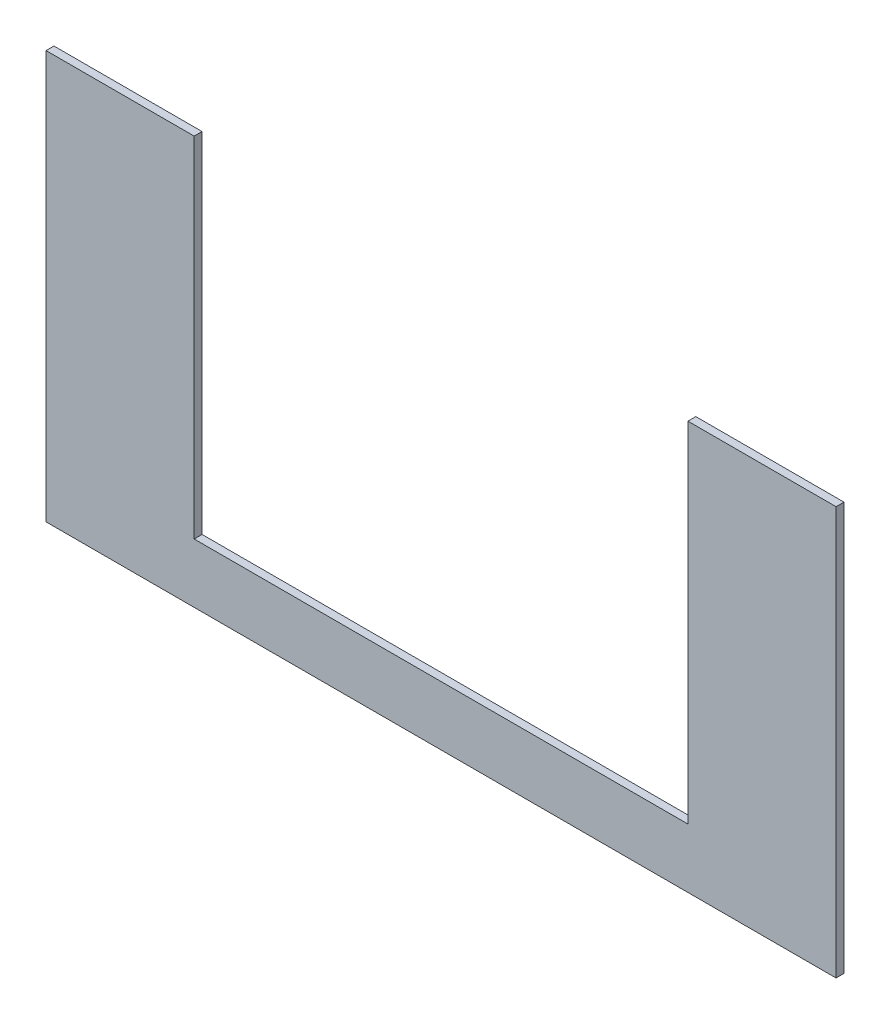
ISO-10303-21;
HEADER;
FILE_DESCRIPTION(('STEP AP214'),'2;1');
FILE_NAME('part.step','',(''),(''),'','','');
FILE_SCHEMA(('AUTOMOTIVE_DESIGN { 1 0 10303 214 1 1 1 1 }'));
ENDSEC;
DATA;
#1=APPLICATION_CONTEXT('core data for automotive mechanical design processes');
#2=APPLICATION_PROTOCOL_DEFINITION('international standard','automotive_design',2000,#1);
#3=PRODUCT_CONTEXT('',#1,'mechanical');
#4=PRODUCT('Part','Part','',(#3));
#5=PRODUCT_RELATED_PRODUCT_CATEGORY('part','',(#4));
#6=PRODUCT_DEFINITION_FORMATION('','',#4);
#7=PRODUCT_DEFINITION_CONTEXT('part definition',#1,'design');
#8=PRODUCT_DEFINITION('design','',#6,#7);
#9=PRODUCT_DEFINITION_SHAPE('','',#8);
#10=(LENGTH_UNIT() NAMED_UNIT(*) SI_UNIT(.MILLI.,.METRE.));
#11=(NAMED_UNIT(*) PLANE_ANGLE_UNIT() SI_UNIT($,.RADIAN.));
#12=(NAMED_UNIT(*) SI_UNIT($,.STERADIAN.) SOLID_ANGLE_UNIT());
#13=UNCERTAINTY_MEASURE_WITH_UNIT(LENGTH_MEASURE(1.E-05),#10,'distance_accuracy_value','');
#14=(GEOMETRIC_REPRESENTATION_CONTEXT(3) GLOBAL_UNCERTAINTY_ASSIGNED_CONTEXT((#13)) GLOBAL_UNIT_ASSIGNED_CONTEXT((#10,
#11,#12)) REPRESENTATION_CONTEXT('',''));
#15=CARTESIAN_POINT('',(0.,0.,0.));
#16=DIRECTION('',(0.,0.,1.));
#17=DIRECTION('',(1.,0.,0.));
#18=AXIS2_PLACEMENT_3D('',#15,#16,#17);
#19=CARTESIAN_POINT('',(-1080.11865915553,-146.009930726626,6.));
#20=DIRECTION('',(1.,0.,0.));
#21=DIRECTION('',(0.,0.,-1.));
#22=AXIS2_PLACEMENT_3D('',#19,#20,#21);
#23=PLANE('',#22);
#24=DIRECTION('',(0.,-1.,0.));
#25=VECTOR('',#24,1.);
#26=CARTESIAN_POINT('',(-1080.11865915553,-146.009930726626,0.));
#27=LINE('',#26,#25);
#28=CARTESIAN_POINT('',(-1080.11865915553,-146.009930726626,0.));
#29=VERTEX_POINT('',#28);
#30=CARTESIAN_POINT('',(-1080.11865915553,-456.009930726626,0.));
#31=VERTEX_POINT('',#30);
#32=EDGE_CURVE('E129',#29,#31,#27,.T.);
#33=ORIENTED_EDGE('',*,*,#32,.T.);
#34=DIRECTION('',(0.,0.,-1.));
#35=VECTOR('',#34,1.);
#36=CARTESIAN_POINT('',(-1080.11865915553,-456.009930726626,6.));
#37=LINE('',#36,#35);
#38=CARTESIAN_POINT('',(-1080.11865915553,-456.009930726626,6.));
#39=VERTEX_POINT('',#38);
#40=EDGE_CURVE('E11',#39,#31,#37,.T.);
#41=ORIENTED_EDGE('',*,*,#40,.F.);
#42=DIRECTION('',(0.,-1.,0.));
#43=VECTOR('',#42,1.);
#44=CARTESIAN_POINT('',(-1080.11865915553,-146.009930726626,6.));
#45=LINE('',#44,#43);
#46=CARTESIAN_POINT('',(-1080.11865915553,-146.009930726626,6.));
#47=VERTEX_POINT('',#46);
#48=EDGE_CURVE('E143',#47,#39,#45,.T.);
#49=ORIENTED_EDGE('',*,*,#48,.F.);
#50=DIRECTION('',(0.,0.,-1.));
#51=VECTOR('',#50,1.);
#52=CARTESIAN_POINT('',(-1080.11865915553,-146.009930726626,6.));
#53=LINE('',#52,#51);
#54=EDGE_CURVE('E125',#47,#29,#53,.T.);
#55=ORIENTED_EDGE('',*,*,#54,.T.);
#56=EDGE_LOOP('',(#33,#41,#49,#55));
#57=FACE_BOUND('',#56,.T.);
#58=ADVANCED_FACE('F33',(#57),#23,.F.);
#59=CARTESIAN_POINT('',(-1080.11865915553,-456.009930726626,6.));
#60=DIRECTION('',(0.,1.,0.));
#61=DIRECTION('',(0.,0.,1.));
#62=AXIS2_PLACEMENT_3D('',#59,#60,#61);
#63=PLANE('',#62);
#64=DIRECTION('',(1.,0.,0.));
#65=VECTOR('',#64,1.);
#66=CARTESIAN_POINT('',(-1080.11865915553,-456.009930726626,0.));
#67=LINE('',#66,#65);
#68=CARTESIAN_POINT('',(-480.118659155528,-456.009930726626,0.));
#69=VERTEX_POINT('',#68);
#70=EDGE_CURVE('E132',#31,#69,#67,.T.);
#71=ORIENTED_EDGE('',*,*,#70,.T.);
#72=DIRECTION('',(0.,0.,-1.));
#73=VECTOR('',#72,1.);
#74=CARTESIAN_POINT('',(-480.118659155528,-456.009930726626,6.));
#75=LINE('',#74,#73);
#76=CARTESIAN_POINT('',(-480.118659155528,-456.009930726626,6.));
#77=VERTEX_POINT('',#76);
#78=EDGE_CURVE('E41',#77,#69,#75,.T.);
#79=ORIENTED_EDGE('',*,*,#78,.F.);
#80=DIRECTION('',(1.,0.,0.));
#81=VECTOR('',#80,1.);
#82=CARTESIAN_POINT('',(-1080.11865915553,-456.009930726626,6.));
#83=LINE('',#82,#81);
#84=EDGE_CURVE('E92',#39,#77,#83,.T.);
#85=ORIENTED_EDGE('',*,*,#84,.F.);
#86=ORIENTED_EDGE('',*,*,#40,.T.);
#87=EDGE_LOOP('',(#71,#79,#85,#86));
#88=FACE_BOUND('',#87,.T.);
#89=ADVANCED_FACE('F178',(#88),#63,.F.);
#90=CARTESIAN_POINT('',(-480.118659155528,-146.009930726626,6.));
#91=DIRECTION('',(-1.,0.,0.));
#92=DIRECTION('',(0.,0.,1.));
#93=AXIS2_PLACEMENT_3D('',#90,#91,#92);
#94=PLANE('',#93);
#95=DIRECTION('',(0.,1.,0.));
#96=VECTOR('',#95,1.);
#97=CARTESIAN_POINT('',(-480.118659155528,-146.009930726626,0.));
#98=LINE('',#97,#96);
#99=CARTESIAN_POINT('',(-480.118659155528,-146.009930726626,0.));
#100=VERTEX_POINT('',#99);
#101=EDGE_CURVE('E134',#69,#100,#98,.T.);
#102=ORIENTED_EDGE('',*,*,#101,.T.);
#103=DIRECTION('',(0.,0.,-1.));
#104=VECTOR('',#103,1.);
#105=CARTESIAN_POINT('',(-480.118659155528,-146.009930726626,6.));
#106=LINE('',#105,#104);
#107=CARTESIAN_POINT('',(-480.118659155528,-146.009930726626,6.));
#108=VERTEX_POINT('',#107);
#109=EDGE_CURVE('E150',#108,#100,#106,.T.);
#110=ORIENTED_EDGE('',*,*,#109,.F.);
#111=DIRECTION('',(0.,1.,0.));
#112=VECTOR('',#111,1.);
#113=CARTESIAN_POINT('',(-480.118659155528,-146.009930726626,6.));
#114=LINE('',#113,#112);
#115=EDGE_CURVE('E158',#77,#108,#114,.T.);
#116=ORIENTED_EDGE('',*,*,#115,.F.);
#117=ORIENTED_EDGE('',*,*,#78,.T.);
#118=EDGE_LOOP('',(#102,#110,#116,#117));
#119=FACE_BOUND('',#118,.T.);
#120=ADVANCED_FACE('F156',(#119),#94,.F.);
#121=CARTESIAN_POINT('',(-592.618659155528,-146.009930726626,6.));
#122=DIRECTION('',(0.,-1.,0.));
#123=DIRECTION('',(0.,0.,-1.));
#124=AXIS2_PLACEMENT_3D('',#121,#122,#123);
#125=PLANE('',#124);
#126=DIRECTION('',(-1.,0.,0.));
#127=VECTOR('',#126,1.);
#128=CARTESIAN_POINT('',(-592.618659155528,-146.009930726626,0.));
#129=LINE('',#128,#127);
#130=CARTESIAN_POINT('',(-592.618659155528,-146.009930726626,0.));
#131=VERTEX_POINT('',#130);
#132=EDGE_CURVE('E136',#100,#131,#129,.T.);
#133=ORIENTED_EDGE('',*,*,#132,.T.);
#134=DIRECTION('',(0.,0.,-1.));
#135=VECTOR('',#134,1.);
#136=CARTESIAN_POINT('',(-592.618659155528,-146.009930726626,6.));
#137=LINE('',#136,#135);
#138=CARTESIAN_POINT('',(-592.618659155528,-146.009930726626,6.));
#139=VERTEX_POINT('',#138);
#140=EDGE_CURVE('E147',#139,#131,#137,.T.);
#141=ORIENTED_EDGE('',*,*,#140,.F.);
#142=DIRECTION('',(-1.,0.,0.));
#143=VECTOR('',#142,1.);
#144=CARTESIAN_POINT('',(-592.618659155528,-146.009930726626,6.));
#145=LINE('',#144,#143);
#146=EDGE_CURVE('E170',#108,#139,#145,.T.);
#147=ORIENTED_EDGE('',*,*,#146,.F.);
#148=ORIENTED_EDGE('',*,*,#109,.T.);
#149=EDGE_LOOP('',(#133,#141,#147,#148));
#150=FACE_BOUND('',#149,.T.);
#151=ADVANCED_FACE('F166',(#150),#125,.F.);
#152=CARTESIAN_POINT('',(-592.618659155528,-146.009930726626,6.));
#153=DIRECTION('',(1.,0.,0.));
#154=DIRECTION('',(0.,0.,-1.));
#155=AXIS2_PLACEMENT_3D('',#152,#153,#154);
#156=PLANE('',#155);
#157=DIRECTION('',(0.,-1.,0.));
#158=VECTOR('',#157,1.);
#159=CARTESIAN_POINT('',(-592.618659155528,-146.009930726626,0.));
#160=LINE('',#159,#158);
#161=CARTESIAN_POINT('',(-592.618659155528,-411.009930726626,0.));
#162=VERTEX_POINT('',#161);
#163=EDGE_CURVE('E138',#131,#162,#160,.T.);
#164=ORIENTED_EDGE('',*,*,#163,.T.);
#165=DIRECTION('',(0.,0.,-1.));
#166=VECTOR('',#165,1.);
#167=CARTESIAN_POINT('',(-592.618659155528,-411.009930726626,6.));
#168=LINE('',#167,#166);
#169=CARTESIAN_POINT('',(-592.618659155528,-411.009930726626,6.));
#170=VERTEX_POINT('',#169);
#171=EDGE_CURVE('E120',#170,#162,#168,.T.);
#172=ORIENTED_EDGE('',*,*,#171,.F.);
#173=DIRECTION('',(0.,-1.,0.));
#174=VECTOR('',#173,1.);
#175=CARTESIAN_POINT('',(-592.618659155528,-146.009930726626,6.));
#176=LINE('',#175,#174);
#177=EDGE_CURVE('E111',#139,#170,#176,.T.);
#178=ORIENTED_EDGE('',*,*,#177,.F.);
#179=ORIENTED_EDGE('',*,*,#140,.T.);
#180=EDGE_LOOP('',(#164,#172,#178,#179));
#181=FACE_BOUND('',#180,.T.);
#182=ADVANCED_FACE('F169',(#181),#156,.F.);
#183=CARTESIAN_POINT('',(-967.618659155528,-411.009930726626,6.));
#184=DIRECTION('',(0.,-1.,0.));
#185=DIRECTION('',(1.,0.,0.));
#186=AXIS2_PLACEMENT_3D('',#183,#184,#185);
#187=PLANE('',#186);
#188=DIRECTION('',(-1.,0.,0.));
#189=VECTOR('',#188,1.);
#190=CARTESIAN_POINT('',(-967.618659155528,-411.009930726626,0.));
#191=LINE('',#190,#189);
#192=CARTESIAN_POINT('',(-967.618659155528,-411.009930726626,0.));
#193=VERTEX_POINT('',#192);
#194=EDGE_CURVE('E119',#162,#193,#191,.T.);
#195=ORIENTED_EDGE('',*,*,#194,.T.);
#196=DIRECTION('',(0.,0.,-1.));
#197=VECTOR('',#196,1.);
#198=CARTESIAN_POINT('',(-967.618659155528,-411.009930726626,6.));
#199=LINE('',#198,#197);
#200=CARTESIAN_POINT('',(-967.618659155528,-411.009930726626,6.));
#201=VERTEX_POINT('',#200);
#202=EDGE_CURVE('E116',#201,#193,#199,.T.);
#203=ORIENTED_EDGE('',*,*,#202,.F.);
#204=DIRECTION('',(-1.,0.,0.));
#205=VECTOR('',#204,1.);
#206=CARTESIAN_POINT('',(-967.618659155528,-411.009930726626,6.));
#207=LINE('',#206,#205);
#208=EDGE_CURVE('E105',#170,#201,#207,.T.);
#209=ORIENTED_EDGE('',*,*,#208,.F.);
#210=ORIENTED_EDGE('',*,*,#171,.T.);
#211=EDGE_LOOP('',(#195,#203,#209,#210));
#212=FACE_BOUND('',#211,.T.);
#213=ADVANCED_FACE('F117',(#212),#187,.F.);
#214=CARTESIAN_POINT('',(-967.618659155528,-146.009930726626,6.));
#215=DIRECTION('',(-1.,0.,0.));
#216=DIRECTION('',(0.,-1.,0.));
#217=AXIS2_PLACEMENT_3D('',#214,#215,#216);
#218=PLANE('',#217);
#219=DIRECTION('',(0.,1.,0.));
#220=VECTOR('',#219,1.);
#221=CARTESIAN_POINT('',(-967.618659155528,-146.009930726626,0.));
#222=LINE('',#221,#220);
#223=CARTESIAN_POINT('',(-967.618659155528,-146.009930726626,0.));
#224=VERTEX_POINT('',#223);
#225=EDGE_CURVE('E78',#193,#224,#222,.T.);
#226=ORIENTED_EDGE('',*,*,#225,.T.);
#227=DIRECTION('',(0.,0.,-1.));
#228=VECTOR('',#227,1.);
#229=CARTESIAN_POINT('',(-967.618659155528,-146.009930726626,6.));
#230=LINE('',#229,#228);
#231=CARTESIAN_POINT('',(-967.618659155528,-146.009930726626,6.));
#232=VERTEX_POINT('',#231);
#233=EDGE_CURVE('E121',#232,#224,#230,.T.);
#234=ORIENTED_EDGE('',*,*,#233,.F.);
#235=DIRECTION('',(0.,1.,0.));
#236=VECTOR('',#235,1.);
#237=CARTESIAN_POINT('',(-967.618659155528,-146.009930726626,6.));
#238=LINE('',#237,#236);
#239=EDGE_CURVE('E109',#201,#232,#238,.T.);
#240=ORIENTED_EDGE('',*,*,#239,.F.);
#241=ORIENTED_EDGE('',*,*,#202,.T.);
#242=EDGE_LOOP('',(#226,#234,#240,#241));
#243=FACE_BOUND('',#242,.T.);
#244=ADVANCED_FACE('F123',(#243),#218,.F.);
#245=CARTESIAN_POINT('',(-1080.11865915553,-146.009930726626,6.));
#246=DIRECTION('',(0.,-1.,0.));
#247=DIRECTION('',(0.,0.,-1.));
#248=AXIS2_PLACEMENT_3D('',#245,#246,#247);
#249=PLANE('',#248);
#250=DIRECTION('',(-1.,0.,0.));
#251=VECTOR('',#250,1.);
#252=CARTESIAN_POINT('',(-1080.11865915553,-146.009930726626,0.));
#253=LINE('',#252,#251);
#254=EDGE_CURVE('E84',#224,#29,#253,.T.);
#255=ORIENTED_EDGE('',*,*,#254,.T.);
#256=ORIENTED_EDGE('',*,*,#54,.F.);
#257=DIRECTION('',(-1.,0.,0.));
#258=VECTOR('',#257,1.);
#259=CARTESIAN_POINT('',(-1080.11865915553,-146.009930726626,6.));
#260=LINE('',#259,#258);
#261=EDGE_CURVE('E49',#232,#47,#260,.T.);
#262=ORIENTED_EDGE('',*,*,#261,.F.);
#263=ORIENTED_EDGE('',*,*,#233,.T.);
#264=EDGE_LOOP('',(#255,#256,#262,#263));
#265=FACE_BOUND('',#264,.T.);
#266=ADVANCED_FACE('F194',(#265),#249,.F.);
#267=CARTESIAN_POINT('',(0.,0.,6.));
#268=DIRECTION('',(0.,0.,1.));
#269=DIRECTION('',(1.,0.,0.));
#270=AXIS2_PLACEMENT_3D('',#267,#268,#269);
#271=PLANE('',#270);
#272=ORIENTED_EDGE('',*,*,#48,.T.);
#273=ORIENTED_EDGE('',*,*,#84,.T.);
#274=ORIENTED_EDGE('',*,*,#115,.T.);
#275=ORIENTED_EDGE('',*,*,#146,.T.);
#276=ORIENTED_EDGE('',*,*,#177,.T.);
#277=ORIENTED_EDGE('',*,*,#208,.T.);
#278=ORIENTED_EDGE('',*,*,#239,.T.);
#279=ORIENTED_EDGE('',*,*,#261,.T.);
#280=EDGE_LOOP('',(#272,#273,#274,#275,#276,#277,#278,#279));
#281=FACE_BOUND('',#280,.T.);
#282=ADVANCED_FACE('F107',(#281),#271,.T.);
#283=CARTESIAN_POINT('',(0.,0.,0.));
#284=DIRECTION('',(0.,0.,1.));
#285=DIRECTION('',(1.,0.,0.));
#286=AXIS2_PLACEMENT_3D('',#283,#284,#285);
#287=PLANE('',#286);
#288=ORIENTED_EDGE('',*,*,#32,.F.);
#289=ORIENTED_EDGE('',*,*,#254,.F.);
#290=ORIENTED_EDGE('',*,*,#225,.F.);
#291=ORIENTED_EDGE('',*,*,#194,.F.);
#292=ORIENTED_EDGE('',*,*,#163,.F.);
#293=ORIENTED_EDGE('',*,*,#132,.F.);
#294=ORIENTED_EDGE('',*,*,#101,.F.);
#295=ORIENTED_EDGE('',*,*,#70,.F.);
#296=EDGE_LOOP('',(#288,#289,#290,#291,#292,#293,#294,#295));
#297=FACE_BOUND('',#296,.T.);
#298=ADVANCED_FACE('F162',(#297),#287,.F.);
#299=CLOSED_SHELL('',(#58,#89,#120,#151,#182,#213,#244,#266,#282,#298));
#300=MANIFOLD_SOLID_BREP('B2',#299);
#301=ADVANCED_BREP_SHAPE_REPRESENTATION('',(#18,#300),#14);
#302=SHAPE_DEFINITION_REPRESENTATION(#9,#301);
ENDSEC;
END-ISO-10303-21;
